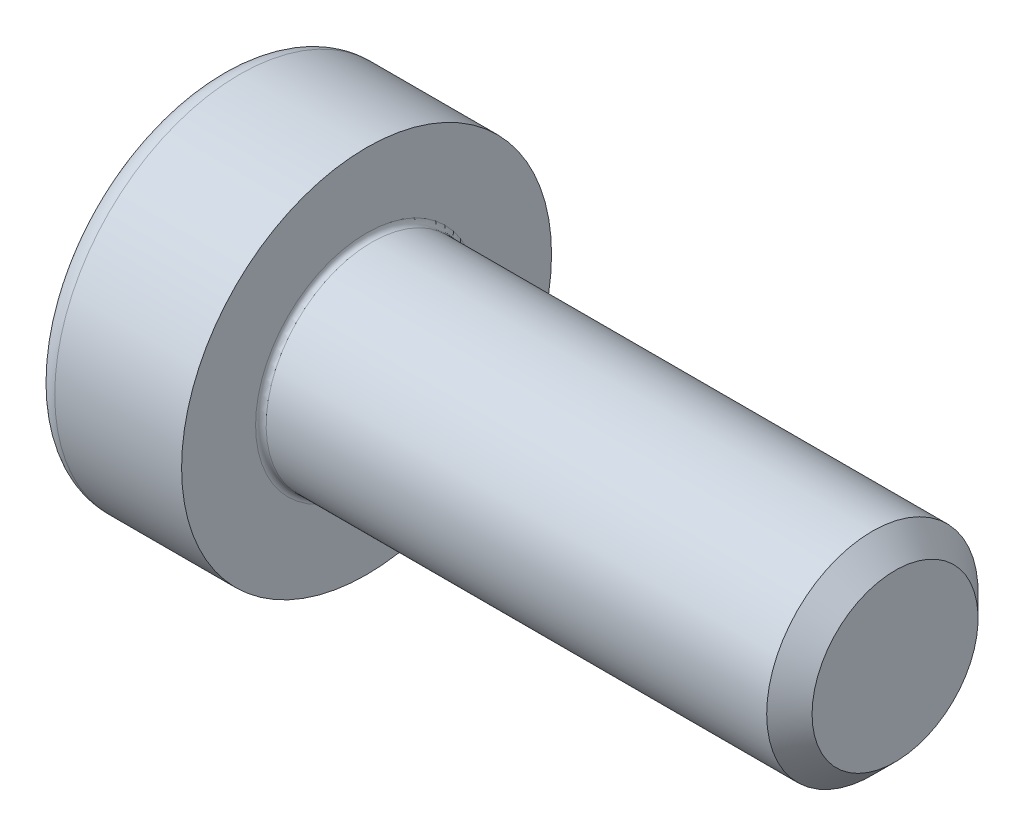
ISO-10303-21;
HEADER;
FILE_DESCRIPTION(('STEP AP214'),'2;1');
FILE_NAME('part.step','',(''),(''),'','','');
FILE_SCHEMA(('AUTOMOTIVE_DESIGN { 1 0 10303 214 1 1 1 1 }'));
ENDSEC;
DATA;
#1=APPLICATION_CONTEXT('core data for automotive mechanical design processes');
#2=APPLICATION_PROTOCOL_DEFINITION('international standard','automotive_design',2000,#1);
#3=PRODUCT_CONTEXT('',#1,'mechanical');
#4=PRODUCT('Part','Part','',(#3));
#5=PRODUCT_RELATED_PRODUCT_CATEGORY('part','',(#4));
#6=PRODUCT_DEFINITION_FORMATION('','',#4);
#7=PRODUCT_DEFINITION_CONTEXT('part definition',#1,'design');
#8=PRODUCT_DEFINITION('design','',#6,#7);
#9=PRODUCT_DEFINITION_SHAPE('','',#8);
#10=(LENGTH_UNIT() NAMED_UNIT(*) SI_UNIT(.MILLI.,.METRE.));
#11=(NAMED_UNIT(*) PLANE_ANGLE_UNIT() SI_UNIT($,.RADIAN.));
#12=(NAMED_UNIT(*) SI_UNIT($,.STERADIAN.) SOLID_ANGLE_UNIT());
#13=UNCERTAINTY_MEASURE_WITH_UNIT(LENGTH_MEASURE(1.E-05),#10,'distance_accuracy_value','');
#14=(GEOMETRIC_REPRESENTATION_CONTEXT(3) GLOBAL_UNCERTAINTY_ASSIGNED_CONTEXT((#13)) GLOBAL_UNIT_ASSIGNED_CONTEXT((#10,
#11,#12)) REPRESENTATION_CONTEXT('',''));
#15=CARTESIAN_POINT('',(0.,0.,0.));
#16=DIRECTION('',(0.,0.,1.));
#17=DIRECTION('',(1.,0.,0.));
#18=AXIS2_PLACEMENT_3D('',#15,#16,#17);
#19=CARTESIAN_POINT('',(-2.8,-1.25,0.721687836487033));
#20=DIRECTION('',(0.,-0.5,0.866025403784439));
#21=DIRECTION('',(0.,-0.866025403784439,-0.5));
#22=AXIS2_PLACEMENT_3D('',#19,#20,#21);
#23=PLANE('',#22);
#24=DIRECTION('',(1.,0.,0.));
#25=VECTOR('',#24,1.);
#26=CARTESIAN_POINT('',(-2.8,-1.25,0.721687836487032));
#27=LINE('',#26,#25);
#28=CARTESIAN_POINT('',(-0.500000000012726,-1.24999999999841,0.721687836486114));
#29=VERTEX_POINT('',#28);
#30=CARTESIAN_POINT('',(-2.8,-1.25,0.721687836487032));
#31=VERTEX_POINT('',#30);
#32=EDGE_CURVE('E79',#29,#31,#27,.F.);
#33=ORIENTED_EDGE('',*,*,#32,.T.);
#34=DIRECTION('',(0.,-0.866025403784439,-0.5));
#35=VECTOR('',#34,1.);
#36=CARTESIAN_POINT('',(-2.8,-1.25,0.721687836487033));
#37=LINE('',#36,#35);
#38=CARTESIAN_POINT('',(-2.8,0.,1.44337567297406));
#39=VERTEX_POINT('',#38);
#40=EDGE_CURVE('E85',#39,#31,#37,.T.);
#41=ORIENTED_EDGE('',*,*,#40,.F.);
#42=DIRECTION('',(1.,0.,0.));
#43=VECTOR('',#42,1.);
#44=CARTESIAN_POINT('',(-2.8,0.,1.44337567297406));
#45=LINE('',#44,#43);
#46=CARTESIAN_POINT('',(-0.500000000013255,-1.59207497371917E-12,1.44337567297314));
#47=VERTEX_POINT('',#46);
#48=EDGE_CURVE('E82',#39,#47,#45,.T.);
#49=ORIENTED_EDGE('',*,*,#48,.T.);
#50=CARTESIAN_POINT('',(-0.500000000012726,-1.24999999999682,0.72168783648887));
#51=CARTESIAN_POINT('',(-0.481684715716377,-1.19507007026983,0.753401646203316));
#52=CARTESIAN_POINT('',(-0.465027923199401,-1.13966598617085,0.785389209072065));
#53=CARTESIAN_POINT('',(-0.435953992136175,-1.0278985333175,0.849918178063587));
#54=CARTESIAN_POINT('',(-0.423547137722017,-0.971533179318236,0.882460730368029));
#55=CARTESIAN_POINT('',(-0.404234974351635,-0.859500978896518,0.947142551439414));
#56=CARTESIAN_POINT('',(-0.397201117258309,-0.803851365235418,0.979271870866948));
#57=CARTESIAN_POINT('',(-0.388805730091798,-0.69229042470667,1.04368160991227));
#58=CARTESIAN_POINT('',(-0.387437246244261,-0.636379503054475,1.0759617955788));
#59=CARTESIAN_POINT('',(-0.390291431357509,-0.531915943927224,1.13627385956143));
#60=CARTESIAN_POINT('',(-0.393813303271098,-0.483347630844075,1.16431478819407));
#61=CARTESIAN_POINT('',(-0.404973312960129,-0.386527411394851,1.22021396795608));
#62=CARTESIAN_POINT('',(-0.412615259241871,-0.338275839654115,1.24807202588941));
#63=CARTESIAN_POINT('',(-0.431718645848268,-0.241256161421971,1.30408636323343));
#64=CARTESIAN_POINT('',(-0.443261026398436,-0.192500327885751,1.33223555685014));
#65=CARTESIAN_POINT('',(-0.469457350536955,-0.0957156437487544,1.38811422029006));
#66=CARTESIAN_POINT('',(-0.484105142982673,-0.0476855541807888,1.41584440543133));
#67=CARTESIAN_POINT('',(-0.500000000012726,-3.18408876986919E-12,1.44337567297223));
#68=B_SPLINE_CURVE_WITH_KNOTS('',3,(#50,#51,#52,#53,#54,#55,#56,#57,#58,#59,#60,#61,#62,#63,#64,
#65,#66,#67),.UNSPECIFIED.,.F.,.F.,(4,2,2,2,2,2,2,2,4),(0.,0.198135007223765,0.396746135643436,
0.590442253847539,0.783900555563555,0.952317364145102,1.12089012111943,1.2932010140512,
1.46517373344049),.UNSPECIFIED.);
#69=EDGE_CURVE('E21',#29,#47,#68,.T.);
#70=ORIENTED_EDGE('',*,*,#69,.F.);
#71=EDGE_LOOP('',(#33,#41,#49,#70));
#72=FACE_BOUND('',#71,.T.);
#73=ADVANCED_FACE('F17',(#72),#23,.F.);
#74=CARTESIAN_POINT('',(-2.8,-1.25,-0.721687836487032));
#75=DIRECTION('',(0.,-1.,0.));
#76=DIRECTION('',(1.,0.,0.));
#77=AXIS2_PLACEMENT_3D('',#74,#75,#76);
#78=PLANE('',#77);
#79=DIRECTION('',(1.,0.,0.));
#80=VECTOR('',#79,1.);
#81=CARTESIAN_POINT('',(-2.8,-1.25,-0.721687836487029));
#82=LINE('',#81,#80);
#83=CARTESIAN_POINT('',(-0.49999999816412,-1.25,-0.7216878300796));
#84=VERTEX_POINT('',#83);
#85=CARTESIAN_POINT('',(-2.8,-1.25,-0.72168783648703));
#86=VERTEX_POINT('',#85);
#87=EDGE_CURVE('E168',#84,#86,#82,.F.);
#88=ORIENTED_EDGE('',*,*,#87,.T.);
#89=DIRECTION('',(0.,0.,1.));
#90=VECTOR('',#89,1.);
#91=CARTESIAN_POINT('',(-2.8,-1.25,-0.721687836487032));
#92=LINE('',#91,#90);
#93=EDGE_CURVE('E96',#31,#86,#92,.F.);
#94=ORIENTED_EDGE('',*,*,#93,.F.);
#95=ORIENTED_EDGE('',*,*,#32,.F.);
#96=CARTESIAN_POINT('',(-0.499999996314455,-1.25,-0.721687823672171));
#97=CARTESIAN_POINT('',(-0.481684712320678,-1.25,-0.658260204455308));
#98=CARTESIAN_POINT('',(-0.465027920125363,-1.25,-0.594285078931178));
#99=CARTESIAN_POINT('',(-0.43595398973031,-1.25,-0.465227141395604));
#100=CARTESIAN_POINT('',(-0.423547135662282,-1.25,-0.400142037020951));
#101=CARTESIAN_POINT('',(-0.404234972978452,-1.25,-0.270778395346219));
#102=CARTESIAN_POINT('',(-0.397201116226907,-1.25,-0.206519756724116));
#103=CARTESIAN_POINT('',(-0.388805729720173,-1.25,-0.0777002791266697));
#104=CARTESIAN_POINT('',(-0.387437246190876,-1.25,-0.0131399080537756));
#105=CARTESIAN_POINT('',(-0.390291431832533,-1.25,0.107484218823611));
#106=CARTESIAN_POINT('',(-0.393813303918129,-1.25,0.163566075265566));
#107=CARTESIAN_POINT('',(-0.404973313813457,-1.25,0.275364433140251));
#108=CARTESIAN_POINT('',(-0.412615260129186,-1.25,0.331080548180939));
#109=CARTESIAN_POINT('',(-0.431718646676558,-1.25,0.443109221187627));
#110=CARTESIAN_POINT('',(-0.443261027129272,-1.25,0.499407607566286));
#111=CARTESIAN_POINT('',(-0.469457350971283,-1.25,0.611164932762984));
#112=CARTESIAN_POINT('',(-0.484105143218355,-1.25,0.666625302217014));
#113=CARTESIAN_POINT('',(-0.500000000012726,-1.25,0.721687836483357));
#114=B_SPLINE_CURVE_WITH_KNOTS('',3,(#96,#97,#98,#99,#100,#101,#102,#103,#104,#105,#106,#107,
#108,#109,#110,#111,#112,#113),.UNSPECIFIED.,.F.,.F.,(4,2,2,2,2,2,2,2,4),(0.,0.19813500635957,
0.396746133892688,0.590442251290265,0.783900552208118,0.952317358365275,1.12089011290585,
1.29320100327195,1.46517372011195),.UNSPECIFIED.);
#115=EDGE_CURVE('E87',#84,#29,#114,.T.);
#116=ORIENTED_EDGE('',*,*,#115,.F.);
#117=EDGE_LOOP('',(#88,#94,#95,#116));
#118=FACE_BOUND('',#117,.T.);
#119=ADVANCED_FACE('F97',(#118),#78,.F.);
#120=CARTESIAN_POINT('',(-2.8,0.,1.44337567297406));
#121=DIRECTION('',(0.,0.500000000000001,0.866025403784438));
#122=DIRECTION('',(0.,-0.866025403784438,0.500000000000001));
#123=AXIS2_PLACEMENT_3D('',#120,#121,#122);
#124=PLANE('',#123);
#125=ORIENTED_EDGE('',*,*,#48,.F.);
#126=DIRECTION('',(0.,-0.866025403784438,0.500000000000001));
#127=VECTOR('',#126,1.);
#128=CARTESIAN_POINT('',(-2.8,0.,1.44337567297406));
#129=LINE('',#128,#127);
#130=CARTESIAN_POINT('',(-2.8,1.25,0.721687836487029));
#131=VERTEX_POINT('',#130);
#132=EDGE_CURVE('E95',#131,#39,#129,.T.);
#133=ORIENTED_EDGE('',*,*,#132,.F.);
#134=DIRECTION('',(1.,0.,0.));
#135=VECTOR('',#134,1.);
#136=CARTESIAN_POINT('',(-2.8,1.25,0.72168783648703));
#137=LINE('',#136,#135);
#138=CARTESIAN_POINT('',(-0.500000004821645,1.25000001442358,0.721687828159571));
#139=VERTEX_POINT('',#138);
#140=EDGE_CURVE('E269',#131,#139,#137,.T.);
#141=ORIENTED_EDGE('',*,*,#140,.T.);
#142=CARTESIAN_POINT('',(-0.500000000012724,3.18080746596566E-12,1.44337567297222));
#143=CARTESIAN_POINT('',(-0.48168471571384,0.05492992973787,1.41166186325333));
#144=CARTESIAN_POINT('',(-0.465027923194758,0.110334013844639,1.37967430038009));
#145=CARTESIAN_POINT('',(-0.435953992128384,0.222101466714794,1.31514533137886));
#146=CARTESIAN_POINT('',(-0.423547137713265,0.278466820723083,1.28260277906921));
#147=CARTESIAN_POINT('',(-0.404234974345858,0.39049902114616,1.21792095799704));
#148=CARTESIAN_POINT('',(-0.397201117254907,0.446148634799383,1.18579163857405));
#149=CARTESIAN_POINT('',(-0.388805730091247,0.55770957531095,1.12138189953865));
#150=CARTESIAN_POINT('',(-0.387437246244113,0.613620496953838,1.08910171387749));
#151=CARTESIAN_POINT('',(-0.390291431412486,0.71808405807321,1.02878964874471));
#152=CARTESIAN_POINT('',(-0.393813303562025,0.766652373153495,1.00074871895902));
#153=CARTESIAN_POINT('',(-0.404973314047567,0.863472596563807,0.94484953691008));
#154=CARTESIAN_POINT('',(-0.412615260890639,0.911724170268415,0.916991477842901));
#155=CARTESIAN_POINT('',(-0.431718648896679,1.00874385247376,0.860977138204952));
#156=CARTESIAN_POINT('',(-0.443261030295299,1.05749968801736,0.83282794342929));
#157=CARTESIAN_POINT('',(-0.469457356315246,1.15428437609608,0.776949277713607));
#158=CARTESIAN_POINT('',(-0.484105149792817,1.20231446759865,0.749219091455394));
#159=CARTESIAN_POINT('',(-0.500000007908364,1.25000002368374,0.721687822813215));
#160=B_SPLINE_CURVE_WITH_KNOTS('',3,(#142,#143,#144,#145,#146,#147,#148,#149,#150,#151,#152,
#153,#154,#155,#156,#157,#158,#159),.UNSPECIFIED.,.F.,.F.,(4,2,2,2,2,2,2,2,4),(0.,
0.198135007251438,0.396746135702335,0.590442253878284,0.783900555563566,0.952317371073209,
1.12089013500126,1.29320103524786,1.46517376189628),.UNSPECIFIED.);
#161=EDGE_CURVE('E162',#47,#139,#160,.T.);
#162=ORIENTED_EDGE('',*,*,#161,.F.);
#163=EDGE_LOOP('',(#125,#133,#141,#162));
#164=FACE_BOUND('',#163,.T.);
#165=ADVANCED_FACE('F169',(#164),#124,.F.);
#166=CARTESIAN_POINT('',(-2.8,0.,-1.44337567297406));
#167=DIRECTION('',(0.,-0.5,-0.866025403784439));
#168=DIRECTION('',(0.,0.866025403784439,-0.5));
#169=AXIS2_PLACEMENT_3D('',#166,#167,#168);
#170=PLANE('',#169);
#171=DIRECTION('',(1.,0.,0.));
#172=VECTOR('',#171,1.);
#173=CARTESIAN_POINT('',(-2.8,0.,-1.44337567297406));
#174=LINE('',#173,#172);
#175=CARTESIAN_POINT('',(-0.499999992316163,-5.19131567150092E-08,-1.44337565964139));
#176=VERTEX_POINT('',#175);
#177=CARTESIAN_POINT('',(-2.8,0.,-1.44337567297406));
#178=VERTEX_POINT('',#177);
#179=EDGE_CURVE('E263',#176,#178,#174,.F.);
#180=ORIENTED_EDGE('',*,*,#179,.T.);
#181=DIRECTION('',(0.,0.866025403784439,-0.5));
#182=VECTOR('',#181,1.);
#183=CARTESIAN_POINT('',(-2.8,0.,-1.44337567297406));
#184=LINE('',#183,#182);
#185=EDGE_CURVE('E41',#86,#178,#184,.T.);
#186=ORIENTED_EDGE('',*,*,#185,.F.);
#187=ORIENTED_EDGE('',*,*,#87,.F.);
#188=CARTESIAN_POINT('',(-0.500000009620751,-1.2500000288209,-0.721687819847277));
#189=CARTESIAN_POINT('',(-0.481684724546346,-1.19507009864123,-0.753401629823076));
#190=CARTESIAN_POINT('',(-0.46502793120038,-1.13966601408686,-0.785389192954742));
#191=CARTESIAN_POINT('',(-0.435953998411218,-1.02789856027996,-0.8499181624968));
#192=CARTESIAN_POINT('',(-0.423547143100863,-0.971533205782277,-0.882460715089003));
#193=CARTESIAN_POINT('',(-0.404234977937411,-0.85950100431182,-0.947142536765877));
#194=CARTESIAN_POINT('',(-0.39720111994863,-0.803851390101623,-0.979271856510434));
#195=CARTESIAN_POINT('',(-0.388805731059005,-0.692290448408831,-1.04368159622782));
#196=CARTESIAN_POINT('',(-0.387437246383409,-0.636379526141792,-1.07596178224933));
#197=CARTESIAN_POINT('',(-0.390291429949312,-0.531915970874843,-1.13627384400321));
#198=CARTESIAN_POINT('',(-0.393813300668912,-0.483347662263053,-1.16431477005431));
#199=CARTESIAN_POINT('',(-0.404973307299901,-0.386527451645455,-1.22021394471738));
#200=CARTESIAN_POINT('',(-0.412615251715936,-0.338275884264775,-1.24807200013343));
#201=CARTESIAN_POINT('',(-0.431718634043812,-0.241256214830581,-1.30408633239795));
#202=CARTESIAN_POINT('',(-0.443261012160606,-0.192500385727477,-1.33223552345519));
#203=CARTESIAN_POINT('',(-0.469457331112052,-0.0957157102846821,-1.38811418187552));
#204=CARTESIAN_POINT('',(-0.484105120806564,-0.0476856249784378,-1.41584436455628));
#205=CARTESIAN_POINT('',(-0.499999975011777,-7.50060251238773E-08,-1.44337562966931));
#206=B_SPLINE_CURVE_WITH_KNOTS('',3,(#188,#189,#190,#191,#192,#193,#194,#195,#196,#197,#198,
#199,#200,#201,#202,#203,#204,#205),.UNSPECIFIED.,.F.,.F.,(4,2,2,2,2,2,2,2,4),(0.,
0.198135009381301,0.396746140005334,0.590442260393921,0.783900564280859,0.952317357223632,
1.12089009850234,1.29320097493783,1.4651736779646),.UNSPECIFIED.);
#207=EDGE_CURVE('E91',#84,#176,#206,.T.);
#208=ORIENTED_EDGE('',*,*,#207,.T.);
#209=EDGE_LOOP('',(#180,#186,#187,#208));
#210=FACE_BOUND('',#209,.T.);
#211=ADVANCED_FACE('F172',(#210),#170,.F.);
#212=CARTESIAN_POINT('',(-2.8,1.25,0.72168783648703));
#213=DIRECTION('',(0.,1.,0.));
#214=DIRECTION('',(0.,0.,1.));
#215=AXIS2_PLACEMENT_3D('',#212,#213,#214);
#216=PLANE('',#215);
#217=ORIENTED_EDGE('',*,*,#140,.F.);
#218=DIRECTION('',(0.,0.,1.));
#219=VECTOR('',#218,1.);
#220=CARTESIAN_POINT('',(-2.8,1.25,0.72168783648703));
#221=LINE('',#220,#219);
#222=CARTESIAN_POINT('',(-2.8,1.25,-0.721687836487033));
#223=VERTEX_POINT('',#222);
#224=EDGE_CURVE('E272',#223,#131,#221,.T.);
#225=ORIENTED_EDGE('',*,*,#224,.F.);
#226=DIRECTION('',(1.,0.,0.));
#227=VECTOR('',#226,1.);
#228=CARTESIAN_POINT('',(-2.8,1.25,-0.721687836487033));
#229=LINE('',#228,#227);
#230=CARTESIAN_POINT('',(-0.500000004817269,1.25,-0.721687853126786));
#231=VERTEX_POINT('',#230);
#232=EDGE_CURVE('E131',#223,#231,#229,.T.);
#233=ORIENTED_EDGE('',*,*,#232,.T.);
#234=CARTESIAN_POINT('',(-0.500000009620752,1.25,-0.721687869766538));
#235=CARTESIAN_POINT('',(-0.481684724546345,1.25,-0.658260249814932));
#236=CARTESIAN_POINT('',(-0.465027931200377,1.25,-0.594285123551592));
#237=CARTESIAN_POINT('',(-0.435953998411212,1.25,-0.46522718446746));
#238=CARTESIAN_POINT('',(-0.423547143100857,1.25,-0.400142079283045));
#239=CARTESIAN_POINT('',(-0.404234977937408,1.25,-0.270778435929295));
#240=CARTESIAN_POINT('',(-0.397201119948629,1.25,-0.20651979644019));
#241=CARTESIAN_POINT('',(-0.388805731059006,1.25,-0.0777003170054428));
#242=CARTESIAN_POINT('',(-0.38743724638341,1.25,-0.0131399449624221));
#243=CARTESIAN_POINT('',(-0.390291429949361,1.25,0.107484178547275));
#244=CARTESIAN_POINT('',(-0.393813300669159,1.25,0.163566030651423));
#245=CARTESIAN_POINT('',(-0.40497330730082,1.25,0.275364379981414));
#246=CARTESIAN_POINT('',(-0.412615251717328,1.25,0.33108049081544));
#247=CARTESIAN_POINT('',(-0.431718634046385,1.25,0.44310915534835));
#248=CARTESIAN_POINT('',(-0.443261012163895,1.25,0.499407537464786));
#249=CARTESIAN_POINT('',(-0.469457331116927,1.25,0.611164854309281));
#250=CARTESIAN_POINT('',(-0.484105120812309,1.25,0.666625219672687));
#251=CARTESIAN_POINT('',(-0.499999975018438,1.25,0.7216877499006));
#252=B_SPLINE_CURVE_WITH_KNOTS('',3,(#234,#235,#236,#237,#238,#239,#240,#241,#242,#243,#244,
#245,#246,#247,#248,#249,#250,#251),.UNSPECIFIED.,.F.,.F.,(4,2,2,2,2,2,2,2,4),(0.,
0.198135009381324,0.396746140005384,0.590442260393947,0.78390056428086,0.952317357229476,
1.12089009851405,1.29320097495571,1.4651736779886),.UNSPECIFIED.);
#253=EDGE_CURVE('E132',#231,#139,#252,.T.);
#254=ORIENTED_EDGE('',*,*,#253,.T.);
#255=EDGE_LOOP('',(#217,#225,#233,#254));
#256=FACE_BOUND('',#255,.T.);
#257=ADVANCED_FACE('F144',(#256),#216,.F.);
#258=CARTESIAN_POINT('',(-0.504999999975553,0.,0.));
#259=DIRECTION('',(-1.,0.,0.));
#260=DIRECTION('',(0.,0.,1.));
#261=AXIS2_PLACEMENT_3D('',#258,#259,#260);
#262=CONICAL_SURFACE('',#261,1.45203592694543,1.04719755118368);
#263=CARTESIAN_POINT('',(0.333333333344399,0.,0.));
#264=VERTEX_POINT('',#263);
#265=VERTEX_LOOP('',#264);
#266=FACE_BOUND('',#265,.T.);
#267=ORIENTED_EDGE('',*,*,#253,.F.);
#268=CARTESIAN_POINT('',(-0.499999996314455,1.249999988902,-0.721687842894464));
#269=CARTESIAN_POINT('',(-0.481684712318148,1.19507005935095,-0.753401652507334));
#270=CARTESIAN_POINT('',(-0.465027920120727,1.13966597542897,-0.785389215273892));
#271=CARTESIAN_POINT('',(-0.435953989722532,1.02789852294635,-0.849918184051369));
#272=CARTESIAN_POINT('',(-0.423547135653544,0.971533169140927,-0.882460736243901));
#273=CARTESIAN_POINT('',(-0.404234972972686,0.859500969123183,-0.947142557082051));
#274=CARTESIAN_POINT('',(-0.397201116223512,0.803851355671706,-0.97927187638856));
#275=CARTESIAN_POINT('',(-0.388805729719625,0.692290415587236,-1.04368161517738));
#276=CARTESIAN_POINT('',(-0.387437246190732,0.636379494169655,-1.07596180070846));
#277=CARTESIAN_POINT('',(-0.390291431887446,0.531915933994866,-1.13627386529588));
#278=CARTESIAN_POINT('',(-0.3938133042087,0.483347619630076,-1.16431479466848));
#279=CARTESIAN_POINT('',(-0.404973314899552,0.386527397653032,-1.22021397588992));
#280=CARTESIAN_POINT('',(-0.412615261775916,0.338275824666179,-1.2480720345427));
#281=CARTESIAN_POINT('',(-0.4317186497212,0.241256143921843,-1.30408637333714));
#282=CARTESIAN_POINT('',(-0.443261031021314,0.192500309120957,-1.33223556768399));
#283=CARTESIAN_POINT('',(-0.469457356742425,0.095715622504775,-1.38811423255528));
#284=CARTESIAN_POINT('',(-0.484105150020072,0.0476855317221033,-1.41584441839786));
#285=CARTESIAN_POINT('',(-0.500000007898593,-2.36544184156069E-08,-1.44337568663095));
#286=B_SPLINE_CURVE_WITH_KNOTS('',3,(#268,#269,#270,#271,#272,#273,#274,#275,#276,#277,#278,
#279,#280,#281,#282,#283,#284,#285),.UNSPECIFIED.,.F.,.F.,(4,2,2,2,2,2,2,2,4),(0.,
0.198135006387209,0.396746133951516,0.590442251320974,0.783900552208132,0.952317365284808,
1.1208901267705,1.29320102444237,1.46517374853252),.UNSPECIFIED.);
#287=EDGE_CURVE('E123',#231,#176,#286,.T.);
#288=ORIENTED_EDGE('',*,*,#287,.T.);
#289=ORIENTED_EDGE('',*,*,#207,.F.);
#290=ORIENTED_EDGE('',*,*,#115,.T.);
#291=ORIENTED_EDGE('',*,*,#69,.T.);
#292=ORIENTED_EDGE('',*,*,#161,.T.);
#293=EDGE_LOOP('',(#267,#288,#289,#290,#291,#292));
#294=FACE_BOUND('',#293,.T.);
#295=ADVANCED_FACE('F89',(#266,#294),#262,.F.);
#296=CARTESIAN_POINT('',(-2.8,1.25,-0.721687836487033));
#297=DIRECTION('',(0.,0.5,-0.866025403784439));
#298=DIRECTION('',(0.,0.866025403784439,0.5));
#299=AXIS2_PLACEMENT_3D('',#296,#297,#298);
#300=PLANE('',#299);
#301=ORIENTED_EDGE('',*,*,#232,.F.);
#302=DIRECTION('',(0.,0.86602540378444,0.499999999999997));
#303=VECTOR('',#302,1.);
#304=CARTESIAN_POINT('',(-2.8,0.,-1.44337567297406));
#305=LINE('',#304,#303);
#306=EDGE_CURVE('E130',#178,#223,#305,.T.);
#307=ORIENTED_EDGE('',*,*,#306,.F.);
#308=ORIENTED_EDGE('',*,*,#179,.F.);
#309=ORIENTED_EDGE('',*,*,#287,.F.);
#310=EDGE_LOOP('',(#301,#307,#308,#309));
#311=FACE_BOUND('',#310,.T.);
#312=ADVANCED_FACE('F139',(#311),#300,.F.);
#313=CARTESIAN_POINT('',(-2.8,2.47168783648703,0.));
#314=DIRECTION('',(-1.,0.,0.));
#315=DIRECTION('',(0.,-1.,0.));
#316=AXIS2_PLACEMENT_3D('',#313,#314,#315);
#317=PLANE('',#316);
#318=ORIENTED_EDGE('',*,*,#185,.T.);
#319=ORIENTED_EDGE('',*,*,#306,.T.);
#320=ORIENTED_EDGE('',*,*,#224,.T.);
#321=ORIENTED_EDGE('',*,*,#132,.T.);
#322=ORIENTED_EDGE('',*,*,#40,.T.);
#323=ORIENTED_EDGE('',*,*,#93,.T.);
#324=EDGE_LOOP('',(#318,#319,#320,#321,#322,#323));
#325=FACE_BOUND('',#324,.T.);
#326=CARTESIAN_POINT('',(-2.8,0.,0.));
#327=DIRECTION('',(1.,0.,0.));
#328=DIRECTION('',(0.,1.,0.));
#329=AXIS2_PLACEMENT_3D('',#326,#327,#328);
#330=CIRCLE('',#329,3.1);
#331=CARTESIAN_POINT('',(-2.8,3.1,0.));
#332=VERTEX_POINT('',#331);
#333=EDGE_CURVE('E244',#332,#332,#330,.T.);
#334=ORIENTED_EDGE('',*,*,#333,.F.);
#335=EDGE_LOOP('',(#334));
#336=FACE_BOUND('',#335,.T.);
#337=ADVANCED_FACE('F231',(#325,#336),#317,.T.);
#338=CARTESIAN_POINT('',(-2.4,0.,0.));
#339=DIRECTION('',(1.,0.,0.));
#340=DIRECTION('',(0.,0.,-1.));
#341=AXIS2_PLACEMENT_3D('',#338,#339,#340);
#342=TOROIDAL_SURFACE('',#341,3.1,0.4);
#343=CARTESIAN_POINT('',(-2.4,0.,0.));
#344=DIRECTION('',(1.,0.,0.));
#345=DIRECTION('',(0.,1.,0.));
#346=AXIS2_PLACEMENT_3D('',#343,#344,#345);
#347=CIRCLE('',#346,3.5);
#348=CARTESIAN_POINT('',(-2.4,3.5,0.));
#349=VERTEX_POINT('',#348);
#350=EDGE_CURVE('E120',#349,#349,#347,.T.);
#351=ORIENTED_EDGE('',*,*,#350,.F.);
#352=EDGE_LOOP('',(#351));
#353=FACE_BOUND('',#352,.T.);
#354=ORIENTED_EDGE('',*,*,#333,.T.);
#355=EDGE_LOOP('',(#354));
#356=FACE_BOUND('',#355,.T.);
#357=ADVANCED_FACE('F226',(#353,#356),#342,.T.);
#358=CARTESIAN_POINT('',(-1.4,0.,0.));
#359=DIRECTION('',(1.,0.,0.));
#360=DIRECTION('',(0.,1.,0.));
#361=AXIS2_PLACEMENT_3D('',#358,#359,#360);
#362=CYLINDRICAL_SURFACE('',#361,3.5);
#363=ORIENTED_EDGE('',*,*,#350,.T.);
#364=EDGE_LOOP('',(#363));
#365=FACE_BOUND('',#364,.T.);
#366=CARTESIAN_POINT('',(0.,0.,0.));
#367=DIRECTION('',(1.,0.,0.));
#368=DIRECTION('',(0.,1.,0.));
#369=AXIS2_PLACEMENT_3D('',#366,#367,#368);
#370=CIRCLE('',#369,3.5);
#371=CARTESIAN_POINT('',(0.,3.5,0.));
#372=VERTEX_POINT('',#371);
#373=EDGE_CURVE('E115',#372,#372,#370,.T.);
#374=ORIENTED_EDGE('',*,*,#373,.F.);
#375=EDGE_LOOP('',(#374));
#376=FACE_BOUND('',#375,.T.);
#377=ADVANCED_FACE('F222',(#365,#376),#362,.T.);
#378=CARTESIAN_POINT('',(10.,0.999999999999999,0.));
#379=DIRECTION('',(1.,0.,0.));
#380=DIRECTION('',(0.,1.,0.));
#381=AXIS2_PLACEMENT_3D('',#378,#379,#380);
#382=PLANE('',#381);
#383=CARTESIAN_POINT('',(10.0000000000477,0.,0.));
#384=DIRECTION('',(-1.,0.,0.));
#385=DIRECTION('',(0.,0.,1.));
#386=AXIS2_PLACEMENT_3D('',#383,#384,#385);
#387=CIRCLE('',#386,1.57058500002449);
#388=CARTESIAN_POINT('',(10.0000000000477,0.,1.57058500002449));
#389=VERTEX_POINT('',#388);
#390=EDGE_CURVE('E111',#389,#389,#387,.T.);
#391=ORIENTED_EDGE('',*,*,#390,.F.);
#392=EDGE_LOOP('',(#391));
#393=FACE_BOUND('',#392,.T.);
#394=ADVANCED_FACE('F219',(#393),#382,.T.);
#395=CARTESIAN_POINT('',(0.,2.75,0.));
#396=DIRECTION('',(1.,0.,0.));
#397=DIRECTION('',(0.,1.,0.));
#398=AXIS2_PLACEMENT_3D('',#395,#396,#397);
#399=PLANE('',#398);
#400=CARTESIAN_POINT('',(0.,0.,0.));
#401=DIRECTION('',(1.,0.,0.));
#402=DIRECTION('',(0.,1.,0.));
#403=AXIS2_PLACEMENT_3D('',#400,#401,#402);
#404=CIRCLE('',#403,2.1);
#405=CARTESIAN_POINT('',(0.,2.1,0.));
#406=VERTEX_POINT('',#405);
#407=EDGE_CURVE('E114',#406,#406,#404,.F.);
#408=ORIENTED_EDGE('',*,*,#407,.T.);
#409=EDGE_LOOP('',(#408));
#410=FACE_BOUND('',#409,.T.);
#411=ORIENTED_EDGE('',*,*,#373,.T.);
#412=EDGE_LOOP('',(#411));
#413=FACE_BOUND('',#412,.T.);
#414=ADVANCED_FACE('F210',(#410,#413),#399,.T.);
#415=CARTESIAN_POINT('',(9.57058500006269,0.,0.));
#416=DIRECTION('',(-1.,0.,0.));
#417=DIRECTION('',(0.,0.,1.));
#418=AXIS2_PLACEMENT_3D('',#415,#416,#417);
#419=CONICAL_SURFACE('',#418,2.00000000000955,0.785398163397448);
#420=ORIENTED_EDGE('',*,*,#390,.T.);
#421=EDGE_LOOP('',(#420));
#422=FACE_BOUND('',#421,.T.);
#423=CARTESIAN_POINT('',(9.570585,0.,0.));
#424=DIRECTION('',(1.,0.,0.));
#425=DIRECTION('',(0.,1.,0.));
#426=AXIS2_PLACEMENT_3D('',#423,#424,#425);
#427=CIRCLE('',#426,2.);
#428=CARTESIAN_POINT('',(9.570585,2.,0.));
#429=VERTEX_POINT('',#428);
#430=EDGE_CURVE('E32',#429,#429,#427,.F.);
#431=ORIENTED_EDGE('',*,*,#430,.F.);
#432=EDGE_LOOP('',(#431));
#433=FACE_BOUND('',#432,.T.);
#434=ADVANCED_FACE('F189',(#422,#433),#419,.T.);
#435=CARTESIAN_POINT('',(0.100000000000002,0.,0.));
#436=DIRECTION('',(1.,0.,0.));
#437=DIRECTION('',(0.,0.,-1.));
#438=AXIS2_PLACEMENT_3D('',#435,#436,#437);
#439=TOROIDAL_SURFACE('',#438,2.1,0.1);
#440=CARTESIAN_POINT('',(0.100000000000002,0.,0.));
#441=DIRECTION('',(1.,0.,0.));
#442=DIRECTION('',(0.,1.,0.));
#443=AXIS2_PLACEMENT_3D('',#440,#441,#442);
#444=CIRCLE('',#443,2.);
#445=CARTESIAN_POINT('',(0.100000000000002,2.,0.));
#446=VERTEX_POINT('',#445);
#447=EDGE_CURVE('E11',#446,#446,#444,.T.);
#448=ORIENTED_EDGE('',*,*,#447,.F.);
#449=EDGE_LOOP('',(#448));
#450=FACE_BOUND('',#449,.T.);
#451=ORIENTED_EDGE('',*,*,#407,.F.);
#452=EDGE_LOOP('',(#451));
#453=FACE_BOUND('',#452,.T.);
#454=ADVANCED_FACE('F183',(#450,#453),#439,.F.);
#455=CARTESIAN_POINT('',(6.05,0.,0.));
#456=DIRECTION('',(1.,0.,0.));
#457=DIRECTION('',(0.,1.,0.));
#458=AXIS2_PLACEMENT_3D('',#455,#456,#457);
#459=CYLINDRICAL_SURFACE('',#458,2.);
#460=ORIENTED_EDGE('',*,*,#447,.T.);
#461=EDGE_LOOP('',(#460));
#462=FACE_BOUND('',#461,.T.);
#463=ORIENTED_EDGE('',*,*,#430,.T.);
#464=EDGE_LOOP('',(#463));
#465=FACE_BOUND('',#464,.T.);
#466=ADVANCED_FACE('F181',(#462,#465),#459,.T.);
#467=CLOSED_SHELL('',(#73,#119,#165,#211,#257,#295,#312,#337,#357,#377,#394,#414,#434,#454,#466));
#468=MANIFOLD_SOLID_BREP('B1',#467);
#469=ADVANCED_BREP_SHAPE_REPRESENTATION('',(#18,#468),#14);
#470=SHAPE_DEFINITION_REPRESENTATION(#9,#469);
ENDSEC;
END-ISO-10303-21;
